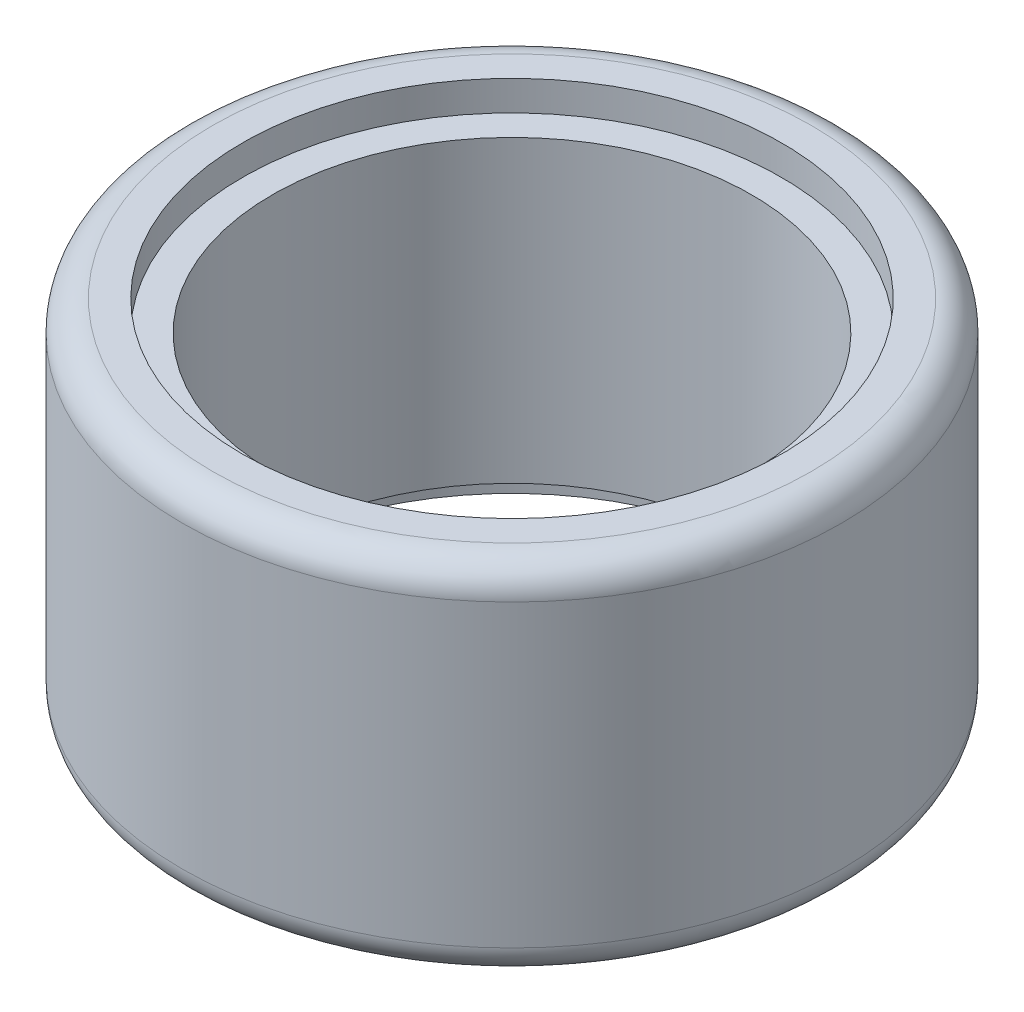
ISO-10303-21;
HEADER;
FILE_DESCRIPTION(('STEP AP214'),'2;1');
FILE_NAME('part.step','',(''),(''),'','','');
FILE_SCHEMA(('AUTOMOTIVE_DESIGN { 1 0 10303 214 1 1 1 1 }'));
ENDSEC;
DATA;
#1=APPLICATION_CONTEXT('core data for automotive mechanical design processes');
#2=APPLICATION_PROTOCOL_DEFINITION('international standard','automotive_design',2000,#1);
#3=PRODUCT_CONTEXT('',#1,'mechanical');
#4=PRODUCT('Part','Part','',(#3));
#5=PRODUCT_RELATED_PRODUCT_CATEGORY('part','',(#4));
#6=PRODUCT_DEFINITION_FORMATION('','',#4);
#7=PRODUCT_DEFINITION_CONTEXT('part definition',#1,'design');
#8=PRODUCT_DEFINITION('design','',#6,#7);
#9=PRODUCT_DEFINITION_SHAPE('','',#8);
#10=(LENGTH_UNIT() NAMED_UNIT(*) SI_UNIT(.MILLI.,.METRE.));
#11=(NAMED_UNIT(*) PLANE_ANGLE_UNIT() SI_UNIT($,.RADIAN.));
#12=(NAMED_UNIT(*) SI_UNIT($,.STERADIAN.) SOLID_ANGLE_UNIT());
#13=UNCERTAINTY_MEASURE_WITH_UNIT(LENGTH_MEASURE(1.E-05),#10,'distance_accuracy_value','');
#14=(GEOMETRIC_REPRESENTATION_CONTEXT(3) GLOBAL_UNCERTAINTY_ASSIGNED_CONTEXT((#13)) GLOBAL_UNIT_ASSIGNED_CONTEXT((#10,
#11,#12)) REPRESENTATION_CONTEXT('',''));
#15=CARTESIAN_POINT('',(0.,0.,0.));
#16=DIRECTION('',(0.,0.,1.));
#17=DIRECTION('',(1.,0.,0.));
#18=AXIS2_PLACEMENT_3D('',#15,#16,#17);
#19=CARTESIAN_POINT('',(0.,6.,0.));
#20=DIRECTION('',(0.,-1.,0.));
#21=DIRECTION('',(0.,0.,-1.));
#22=AXIS2_PLACEMENT_3D('',#19,#20,#21);
#23=CYLINDRICAL_SURFACE('',#22,8.);
#24=CARTESIAN_POINT('',(0.,5.,0.));
#25=DIRECTION('',(0.,1.,0.));
#26=DIRECTION('',(0.,0.,1.));
#27=AXIS2_PLACEMENT_3D('',#24,#25,#26);
#28=CIRCLE('',#27,8.);
#29=CARTESIAN_POINT('',(0.,5.,8.));
#30=VERTEX_POINT('',#29);
#31=EDGE_CURVE('E56',#30,#30,#28,.T.);
#32=ORIENTED_EDGE('',*,*,#31,.T.);
#33=EDGE_LOOP('',(#32));
#34=FACE_BOUND('',#33,.T.);
#35=CARTESIAN_POINT('',(0.,-5.,0.));
#36=DIRECTION('',(0.,1.,0.));
#37=DIRECTION('',(0.,0.,1.));
#38=AXIS2_PLACEMENT_3D('',#35,#36,#37);
#39=CIRCLE('',#38,8.);
#40=CARTESIAN_POINT('',(0.,-5.,8.));
#41=VERTEX_POINT('',#40);
#42=EDGE_CURVE('E65',#41,#41,#39,.T.);
#43=ORIENTED_EDGE('',*,*,#42,.F.);
#44=EDGE_LOOP('',(#43));
#45=FACE_BOUND('',#44,.T.);
#46=ADVANCED_FACE('F32',(#34,#45),#23,.F.);
#47=CARTESIAN_POINT('',(0.,-6.,0.));
#48=DIRECTION('',(0.,1.,0.));
#49=DIRECTION('',(0.,0.,1.));
#50=AXIS2_PLACEMENT_3D('',#47,#48,#49);
#51=PLANE('',#50);
#52=CARTESIAN_POINT('',(0.,-6.,0.));
#53=DIRECTION('',(0.,1.,0.));
#54=DIRECTION('',(0.,0.,1.));
#55=AXIS2_PLACEMENT_3D('',#52,#53,#54);
#56=CIRCLE('',#55,10.);
#57=CARTESIAN_POINT('',(0.,-6.,10.));
#58=VERTEX_POINT('',#57);
#59=EDGE_CURVE('E39',#58,#58,#56,.F.);
#60=ORIENTED_EDGE('',*,*,#59,.T.);
#61=EDGE_LOOP('',(#60));
#62=FACE_BOUND('',#61,.T.);
#63=CARTESIAN_POINT('',(0.,-6.,0.));
#64=DIRECTION('',(0.,1.,0.));
#65=DIRECTION('',(0.,0.,1.));
#66=AXIS2_PLACEMENT_3D('',#63,#64,#65);
#67=CIRCLE('',#66,9.);
#68=CARTESIAN_POINT('',(0.,-6.,9.));
#69=VERTEX_POINT('',#68);
#70=EDGE_CURVE('E62',#69,#69,#67,.T.);
#71=ORIENTED_EDGE('',*,*,#70,.T.);
#72=EDGE_LOOP('',(#71));
#73=FACE_BOUND('',#72,.T.);
#74=ADVANCED_FACE('F74',(#62,#73),#51,.F.);
#75=CARTESIAN_POINT('',(0.,6.,0.));
#76=DIRECTION('',(0.,1.,0.));
#77=DIRECTION('',(0.,0.,1.));
#78=AXIS2_PLACEMENT_3D('',#75,#76,#77);
#79=PLANE('',#78);
#80=CARTESIAN_POINT('',(0.,6.,0.));
#81=DIRECTION('',(0.,1.,0.));
#82=DIRECTION('',(0.,0.,1.));
#83=AXIS2_PLACEMENT_3D('',#80,#81,#82);
#84=CIRCLE('',#83,9.);
#85=CARTESIAN_POINT('',(0.,6.,9.));
#86=VERTEX_POINT('',#85);
#87=EDGE_CURVE('E53',#86,#86,#84,.T.);
#88=ORIENTED_EDGE('',*,*,#87,.F.);
#89=EDGE_LOOP('',(#88));
#90=FACE_BOUND('',#89,.T.);
#91=CARTESIAN_POINT('',(0.,6.,0.));
#92=DIRECTION('',(0.,1.,0.));
#93=DIRECTION('',(0.,0.,1.));
#94=AXIS2_PLACEMENT_3D('',#91,#92,#93);
#95=CIRCLE('',#94,10.);
#96=CARTESIAN_POINT('',(0.,6.,10.));
#97=VERTEX_POINT('',#96);
#98=EDGE_CURVE('E10',#97,#97,#95,.T.);
#99=ORIENTED_EDGE('',*,*,#98,.T.);
#100=EDGE_LOOP('',(#99));
#101=FACE_BOUND('',#100,.T.);
#102=ADVANCED_FACE('F80',(#90,#101),#79,.T.);
#103=CARTESIAN_POINT('',(0.,6.,0.));
#104=DIRECTION('',(0.,-1.,0.));
#105=DIRECTION('',(0.,0.,-1.));
#106=AXIS2_PLACEMENT_3D('',#103,#104,#105);
#107=CYLINDRICAL_SURFACE('',#106,11.);
#108=CARTESIAN_POINT('',(0.,-5.,0.));
#109=DIRECTION('',(0.,1.,0.));
#110=DIRECTION('',(0.,0.,1.));
#111=AXIS2_PLACEMENT_3D('',#108,#109,#110);
#112=CIRCLE('',#111,11.);
#113=CARTESIAN_POINT('',(0.,-5.,11.));
#114=VERTEX_POINT('',#113);
#115=EDGE_CURVE('E43',#114,#114,#112,.T.);
#116=ORIENTED_EDGE('',*,*,#115,.T.);
#117=EDGE_LOOP('',(#116));
#118=FACE_BOUND('',#117,.T.);
#119=CARTESIAN_POINT('',(0.,5.,0.));
#120=DIRECTION('',(0.,1.,0.));
#121=DIRECTION('',(0.,0.,1.));
#122=AXIS2_PLACEMENT_3D('',#119,#120,#121);
#123=CIRCLE('',#122,11.);
#124=CARTESIAN_POINT('',(0.,5.,11.));
#125=VERTEX_POINT('',#124);
#126=EDGE_CURVE('E47',#125,#125,#123,.F.);
#127=ORIENTED_EDGE('',*,*,#126,.T.);
#128=EDGE_LOOP('',(#127));
#129=FACE_BOUND('',#128,.T.);
#130=ADVANCED_FACE('F87',(#118,#129),#107,.T.);
#131=CARTESIAN_POINT('',(0.,-5.,0.));
#132=DIRECTION('',(0.,1.,0.));
#133=DIRECTION('',(0.,0.,1.));
#134=AXIS2_PLACEMENT_3D('',#131,#132,#133);
#135=TOROIDAL_SURFACE('',#134,10.,1.);
#136=ORIENTED_EDGE('',*,*,#59,.F.);
#137=EDGE_LOOP('',(#136));
#138=FACE_BOUND('',#137,.T.);
#139=ORIENTED_EDGE('',*,*,#115,.F.);
#140=EDGE_LOOP('',(#139));
#141=FACE_BOUND('',#140,.T.);
#142=ADVANCED_FACE('F91',(#138,#141),#135,.T.);
#143=CARTESIAN_POINT('',(0.,5.,0.));
#144=DIRECTION('',(0.,1.,0.));
#145=DIRECTION('',(0.,0.,1.));
#146=AXIS2_PLACEMENT_3D('',#143,#144,#145);
#147=TOROIDAL_SURFACE('',#146,10.,1.);
#148=ORIENTED_EDGE('',*,*,#126,.F.);
#149=EDGE_LOOP('',(#148));
#150=FACE_BOUND('',#149,.T.);
#151=ORIENTED_EDGE('',*,*,#98,.F.);
#152=EDGE_LOOP('',(#151));
#153=FACE_BOUND('',#152,.T.);
#154=ADVANCED_FACE('F34',(#150,#153),#147,.T.);
#155=CARTESIAN_POINT('',(0.,5.,0.));
#156=DIRECTION('',(0.,1.,0.));
#157=DIRECTION('',(0.,0.,1.));
#158=AXIS2_PLACEMENT_3D('',#155,#156,#157);
#159=CYLINDRICAL_SURFACE('',#158,9.);
#160=CARTESIAN_POINT('',(0.,5.,0.));
#161=DIRECTION('',(0.,1.,0.));
#162=DIRECTION('',(0.,0.,1.));
#163=AXIS2_PLACEMENT_3D('',#160,#161,#162);
#164=CIRCLE('',#163,9.);
#165=CARTESIAN_POINT('',(0.,5.,9.));
#166=VERTEX_POINT('',#165);
#167=EDGE_CURVE('E52',#166,#166,#164,.T.);
#168=ORIENTED_EDGE('',*,*,#167,.F.);
#169=EDGE_LOOP('',(#168));
#170=FACE_BOUND('',#169,.T.);
#171=ORIENTED_EDGE('',*,*,#87,.T.);
#172=EDGE_LOOP('',(#171));
#173=FACE_BOUND('',#172,.T.);
#174=ADVANCED_FACE('F84',(#170,#173),#159,.F.);
#175=CARTESIAN_POINT('',(0.,5.,0.));
#176=DIRECTION('',(0.,1.,0.));
#177=DIRECTION('',(0.,0.,1.));
#178=AXIS2_PLACEMENT_3D('',#175,#176,#177);
#179=PLANE('',#178);
#180=ORIENTED_EDGE('',*,*,#31,.F.);
#181=EDGE_LOOP('',(#180));
#182=FACE_BOUND('',#181,.T.);
#183=ORIENTED_EDGE('',*,*,#167,.T.);
#184=EDGE_LOOP('',(#183));
#185=FACE_BOUND('',#184,.T.);
#186=ADVANCED_FACE('F107',(#182,#185),#179,.T.);
#187=CARTESIAN_POINT('',(0.,-5.,0.));
#188=DIRECTION('',(0.,-1.,0.));
#189=DIRECTION('',(0.,0.,1.));
#190=AXIS2_PLACEMENT_3D('',#187,#188,#189);
#191=PLANE('',#190);
#192=CARTESIAN_POINT('',(0.,-5.,0.));
#193=DIRECTION('',(0.,1.,0.));
#194=DIRECTION('',(0.,0.,1.));
#195=AXIS2_PLACEMENT_3D('',#192,#193,#194);
#196=CIRCLE('',#195,9.);
#197=CARTESIAN_POINT('',(0.,-5.,9.));
#198=VERTEX_POINT('',#197);
#199=EDGE_CURVE('E61',#198,#198,#196,.T.);
#200=ORIENTED_EDGE('',*,*,#199,.F.);
#201=EDGE_LOOP('',(#200));
#202=FACE_BOUND('',#201,.T.);
#203=ORIENTED_EDGE('',*,*,#42,.T.);
#204=EDGE_LOOP('',(#203));
#205=FACE_BOUND('',#204,.T.);
#206=ADVANCED_FACE('F71',(#202,#205),#191,.T.);
#207=CARTESIAN_POINT('',(0.,-5.,0.));
#208=DIRECTION('',(0.,-1.,0.));
#209=DIRECTION('',(0.,0.,-1.));
#210=AXIS2_PLACEMENT_3D('',#207,#208,#209);
#211=CYLINDRICAL_SURFACE('',#210,9.);
#212=ORIENTED_EDGE('',*,*,#199,.T.);
#213=EDGE_LOOP('',(#212));
#214=FACE_BOUND('',#213,.T.);
#215=ORIENTED_EDGE('',*,*,#70,.F.);
#216=EDGE_LOOP('',(#215));
#217=FACE_BOUND('',#216,.T.);
#218=ADVANCED_FACE('F120',(#214,#217),#211,.F.);
#219=CLOSED_SHELL('',(#46,#74,#102,#130,#142,#154,#174,#186,#206,#218));
#220=MANIFOLD_SOLID_BREP('B2',#219);
#221=ADVANCED_BREP_SHAPE_REPRESENTATION('',(#18,#220),#14);
#222=SHAPE_DEFINITION_REPRESENTATION(#9,#221);
ENDSEC;
END-ISO-10303-21;
